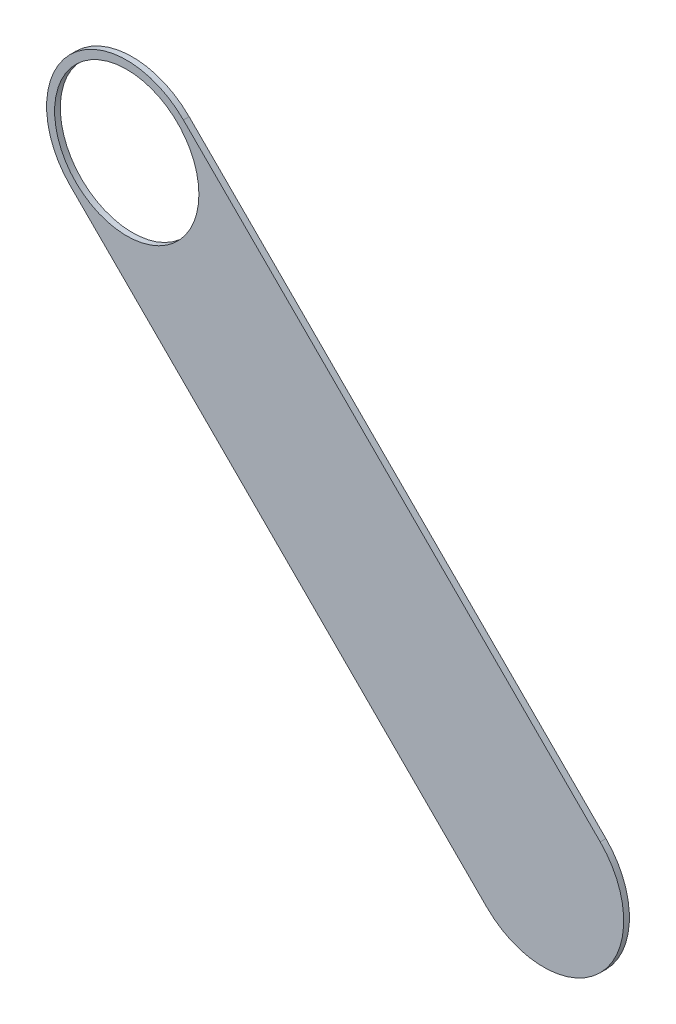
ISO-10303-21;
HEADER;
FILE_DESCRIPTION(('STEP AP214'),'2;1');
FILE_NAME('part.step','',(''),(''),'','','');
FILE_SCHEMA(('AUTOMOTIVE_DESIGN { 1 0 10303 214 1 1 1 1 }'));
ENDSEC;
DATA;
#1=APPLICATION_CONTEXT('core data for automotive mechanical design processes');
#2=APPLICATION_PROTOCOL_DEFINITION('international standard','automotive_design',2000,#1);
#3=PRODUCT_CONTEXT('',#1,'mechanical');
#4=PRODUCT('Part','Part','',(#3));
#5=PRODUCT_RELATED_PRODUCT_CATEGORY('part','',(#4));
#6=PRODUCT_DEFINITION_FORMATION('','',#4);
#7=PRODUCT_DEFINITION_CONTEXT('part definition',#1,'design');
#8=PRODUCT_DEFINITION('design','',#6,#7);
#9=PRODUCT_DEFINITION_SHAPE('','',#8);
#10=(LENGTH_UNIT() NAMED_UNIT(*) SI_UNIT(.MILLI.,.METRE.));
#11=(NAMED_UNIT(*) PLANE_ANGLE_UNIT() SI_UNIT($,.RADIAN.));
#12=(NAMED_UNIT(*) SI_UNIT($,.STERADIAN.) SOLID_ANGLE_UNIT());
#13=UNCERTAINTY_MEASURE_WITH_UNIT(LENGTH_MEASURE(1.E-05),#10,'distance_accuracy_value','');
#14=(GEOMETRIC_REPRESENTATION_CONTEXT(3) GLOBAL_UNCERTAINTY_ASSIGNED_CONTEXT((#13)) GLOBAL_UNIT_ASSIGNED_CONTEXT((#10,
#11,#12)) REPRESENTATION_CONTEXT('',''));
#15=CARTESIAN_POINT('',(0.,0.,0.));
#16=DIRECTION('',(0.,0.,1.));
#17=DIRECTION('',(1.,0.,0.));
#18=AXIS2_PLACEMENT_3D('',#15,#16,#17);
#19=CARTESIAN_POINT('',(116.94644124,74.1264583,0.));
#20=DIRECTION('',(0.707106781186548,0.707106781186548,0.));
#21=DIRECTION('',(0.707106781186548,-0.707106781186548,0.));
#22=AXIS2_PLACEMENT_3D('',#19,#20,#21);
#23=PLANE('',#22);
#24=DIRECTION('',(0.707106781186548,-0.707106781186548,0.));
#25=VECTOR('',#24,1.);
#26=CARTESIAN_POINT('',(116.94644124,74.1264583,0.03556));
#27=LINE('',#26,#25);
#28=CARTESIAN_POINT('',(116.94644124,74.1264583,0.03556));
#29=VERTEX_POINT('',#28);
#30=CARTESIAN_POINT('',(119.5464462,71.52645334,0.03556));
#31=VERTEX_POINT('',#30);
#32=EDGE_CURVE('E11',#29,#31,#27,.T.);
#33=ORIENTED_EDGE('',*,*,#32,.F.);
#34=DIRECTION('',(0.,0.,1.));
#35=VECTOR('',#34,1.);
#36=CARTESIAN_POINT('',(116.94644124,74.1264583,0.));
#37=LINE('',#36,#35);
#38=CARTESIAN_POINT('',(116.94644124,74.1264583,0.));
#39=VERTEX_POINT('',#38);
#40=EDGE_CURVE('E24',#39,#29,#37,.T.);
#41=ORIENTED_EDGE('',*,*,#40,.F.);
#42=DIRECTION('',(0.707106781186548,-0.707106781186548,0.));
#43=VECTOR('',#42,1.);
#44=CARTESIAN_POINT('',(116.94644124,74.1264583,0.));
#45=LINE('',#44,#43);
#46=CARTESIAN_POINT('',(119.5464462,71.52645334,0.));
#47=VERTEX_POINT('',#46);
#48=EDGE_CURVE('E96',#39,#47,#45,.T.);
#49=ORIENTED_EDGE('',*,*,#48,.T.);
#50=DIRECTION('',(0.,0.,1.));
#51=VECTOR('',#50,1.);
#52=CARTESIAN_POINT('',(119.5464462,71.52645334,0.));
#53=LINE('',#52,#51);
#54=EDGE_CURVE('E37',#47,#31,#53,.T.);
#55=ORIENTED_EDGE('',*,*,#54,.T.);
#56=EDGE_LOOP('',(#33,#41,#49,#55));
#57=FACE_BOUND('',#56,.T.);
#58=ADVANCED_FACE('F17',(#57),#23,.F.);
#59=CARTESIAN_POINT('',(117.299994,74.48001106,0.));
#60=DIRECTION('',(0.,0.,-1.));
#61=DIRECTION('',(0.707106781186533,0.707106781186562,0.));
#62=AXIS2_PLACEMENT_3D('',#59,#60,#61);
#63=CYLINDRICAL_SURFACE('',#62,0.499999108206436);
#64=CARTESIAN_POINT('',(117.299994,74.48001106,0.03556));
#65=DIRECTION('',(0.,0.,1.));
#66=DIRECTION('',(0.707106781186533,0.707106781186562,0.));
#67=AXIS2_PLACEMENT_3D('',#64,#65,#66);
#68=CIRCLE('',#67,0.499999108206436);
#69=CARTESIAN_POINT('',(117.65354676,74.83356382,0.03556));
#70=VERTEX_POINT('',#69);
#71=EDGE_CURVE('E92',#70,#29,#68,.T.);
#72=ORIENTED_EDGE('',*,*,#71,.F.);
#73=DIRECTION('',(0.,0.,1.));
#74=VECTOR('',#73,1.);
#75=CARTESIAN_POINT('',(117.65354676,74.83356382,0.));
#76=LINE('',#75,#74);
#77=CARTESIAN_POINT('',(117.65354676,74.83356382,0.));
#78=VERTEX_POINT('',#77);
#79=EDGE_CURVE('E90',#78,#70,#76,.T.);
#80=ORIENTED_EDGE('',*,*,#79,.F.);
#81=CARTESIAN_POINT('',(117.299994,74.48001106,0.));
#82=DIRECTION('',(0.,0.,1.));
#83=DIRECTION('',(0.707106781186533,0.707106781186562,0.));
#84=AXIS2_PLACEMENT_3D('',#81,#82,#83);
#85=CIRCLE('',#84,0.499999108206436);
#86=EDGE_CURVE('E88',#78,#39,#85,.T.);
#87=ORIENTED_EDGE('',*,*,#86,.T.);
#88=ORIENTED_EDGE('',*,*,#40,.T.);
#89=EDGE_LOOP('',(#72,#80,#87,#88));
#90=FACE_BOUND('',#89,.T.);
#91=ADVANCED_FACE('F111',(#90),#63,.T.);
#92=CARTESIAN_POINT('',(119.89999896,71.8800061,0.));
#93=DIRECTION('',(0.,0.,-1.));
#94=DIRECTION('',(-0.707106781186533,-0.707106781186562,0.));
#95=AXIS2_PLACEMENT_3D('',#92,#93,#94);
#96=CYLINDRICAL_SURFACE('',#95,0.499999108206439);
#97=CARTESIAN_POINT('',(119.89999896,71.8800061,0.03556));
#98=DIRECTION('',(0.,0.,1.));
#99=DIRECTION('',(-0.707106781186533,-0.707106781186562,0.));
#100=AXIS2_PLACEMENT_3D('',#97,#98,#99);
#101=CIRCLE('',#100,0.499999108206439);
#102=CARTESIAN_POINT('',(120.25355172,72.23355886,0.03556));
#103=VERTEX_POINT('',#102);
#104=EDGE_CURVE('E85',#31,#103,#101,.T.);
#105=ORIENTED_EDGE('',*,*,#104,.F.);
#106=ORIENTED_EDGE('',*,*,#54,.F.);
#107=CARTESIAN_POINT('',(119.89999896,71.8800061,0.));
#108=DIRECTION('',(0.,0.,1.));
#109=DIRECTION('',(-0.707106781186533,-0.707106781186562,0.));
#110=AXIS2_PLACEMENT_3D('',#107,#108,#109);
#111=CIRCLE('',#110,0.499999108206439);
#112=CARTESIAN_POINT('',(120.25355172,72.23355886,0.));
#113=VERTEX_POINT('',#112);
#114=EDGE_CURVE('E82',#47,#113,#111,.T.);
#115=ORIENTED_EDGE('',*,*,#114,.T.);
#116=DIRECTION('',(0.,0.,1.));
#117=VECTOR('',#116,1.);
#118=CARTESIAN_POINT('',(120.25355172,72.23355886,0.));
#119=LINE('',#118,#117);
#120=EDGE_CURVE('E80',#113,#103,#119,.T.);
#121=ORIENTED_EDGE('',*,*,#120,.T.);
#122=EDGE_LOOP('',(#105,#106,#115,#121));
#123=FACE_BOUND('',#122,.T.);
#124=ADVANCED_FACE('F104',(#123),#96,.T.);
#125=CARTESIAN_POINT('',(120.25355172,72.23355886,0.));
#126=DIRECTION('',(-0.707106781186546,-0.70710678118655,0.));
#127=DIRECTION('',(-0.70710678118655,0.707106781186546,0.));
#128=AXIS2_PLACEMENT_3D('',#125,#126,#127);
#129=PLANE('',#128);
#130=DIRECTION('',(-0.70710678118655,0.707106781186546,0.));
#131=VECTOR('',#130,1.);
#132=CARTESIAN_POINT('',(120.25355172,72.23355886,0.03556));
#133=LINE('',#132,#131);
#134=EDGE_CURVE('E77',#103,#70,#133,.T.);
#135=ORIENTED_EDGE('',*,*,#134,.F.);
#136=ORIENTED_EDGE('',*,*,#120,.F.);
#137=DIRECTION('',(-0.70710678118655,0.707106781186546,0.));
#138=VECTOR('',#137,1.);
#139=CARTESIAN_POINT('',(120.25355172,72.23355886,0.));
#140=LINE('',#139,#138);
#141=EDGE_CURVE('E68',#113,#78,#140,.T.);
#142=ORIENTED_EDGE('',*,*,#141,.T.);
#143=ORIENTED_EDGE('',*,*,#79,.T.);
#144=EDGE_LOOP('',(#135,#136,#142,#143));
#145=FACE_BOUND('',#144,.T.);
#146=ADVANCED_FACE('F110',(#145),#129,.F.);
#147=CARTESIAN_POINT('',(117.299994,74.4800136,0.));
#148=DIRECTION('',(0.,0.,-1.));
#149=DIRECTION('',(1.,0.,0.));
#150=AXIS2_PLACEMENT_3D('',#147,#148,#149);
#151=CYLINDRICAL_SURFACE('',#150,0.4499991);
#152=DIRECTION('',(0.,0.,1.));
#153=VECTOR('',#152,1.);
#154=CARTESIAN_POINT('',(117.7499931,74.4800136,0.));
#155=LINE('',#154,#153);
#156=CARTESIAN_POINT('',(117.7499931,74.4800136,0.));
#157=VERTEX_POINT('',#156);
#158=CARTESIAN_POINT('',(117.7499931,74.4800136,0.03556));
#159=VERTEX_POINT('',#158);
#160=EDGE_CURVE('E62',#157,#159,#155,.T.);
#161=ORIENTED_EDGE('',*,*,#160,.T.);
#162=CARTESIAN_POINT('',(117.299994,74.4800136,0.03556));
#163=DIRECTION('',(0.,0.,1.));
#164=DIRECTION('',(1.,0.,0.));
#165=AXIS2_PLACEMENT_3D('',#162,#163,#164);
#166=CIRCLE('',#165,0.4499991);
#167=EDGE_CURVE('E67',#159,#159,#166,.T.);
#168=ORIENTED_EDGE('',*,*,#167,.T.);
#169=ORIENTED_EDGE('',*,*,#160,.F.);
#170=CARTESIAN_POINT('',(117.299994,74.4800136,0.));
#171=DIRECTION('',(0.,0.,1.));
#172=DIRECTION('',(1.,0.,0.));
#173=AXIS2_PLACEMENT_3D('',#170,#171,#172);
#174=CIRCLE('',#173,0.4499991);
#175=EDGE_CURVE('E65',#157,#157,#174,.T.);
#176=ORIENTED_EDGE('',*,*,#175,.F.);
#177=EDGE_LOOP('',(#161,#168,#169,#176));
#178=FACE_BOUND('',#177,.T.);
#179=ADVANCED_FACE('F64',(#178),#151,.F.);
#180=CARTESIAN_POINT('',(116.94644124,74.1264583,0.));
#181=DIRECTION('',(0.,0.,-1.));
#182=DIRECTION('',(-1.,0.,0.));
#183=AXIS2_PLACEMENT_3D('',#180,#181,#182);
#184=PLANE('',#183);
#185=ORIENTED_EDGE('',*,*,#48,.F.);
#186=ORIENTED_EDGE('',*,*,#86,.F.);
#187=ORIENTED_EDGE('',*,*,#141,.F.);
#188=ORIENTED_EDGE('',*,*,#114,.F.);
#189=EDGE_LOOP('',(#185,#186,#187,#188));
#190=FACE_BOUND('',#189,.T.);
#191=ORIENTED_EDGE('',*,*,#175,.T.);
#192=EDGE_LOOP('',(#191));
#193=FACE_BOUND('',#192,.T.);
#194=ADVANCED_FACE('F71',(#190,#193),#184,.T.);
#195=CARTESIAN_POINT('',(116.94644124,74.1264583,0.03556));
#196=DIRECTION('',(0.,0.,-1.));
#197=DIRECTION('',(-1.,0.,0.));
#198=AXIS2_PLACEMENT_3D('',#195,#196,#197);
#199=PLANE('',#198);
#200=ORIENTED_EDGE('',*,*,#134,.T.);
#201=ORIENTED_EDGE('',*,*,#71,.T.);
#202=ORIENTED_EDGE('',*,*,#32,.T.);
#203=ORIENTED_EDGE('',*,*,#104,.T.);
#204=EDGE_LOOP('',(#200,#201,#202,#203));
#205=FACE_BOUND('',#204,.T.);
#206=ORIENTED_EDGE('',*,*,#167,.F.);
#207=EDGE_LOOP('',(#206));
#208=FACE_BOUND('',#207,.T.);
#209=ADVANCED_FACE('F107',(#205,#208),#199,.F.);
#210=CLOSED_SHELL('',(#58,#91,#124,#146,#179,#194,#209));
#211=MANIFOLD_SOLID_BREP('B1',#210);
#212=ADVANCED_BREP_SHAPE_REPRESENTATION('',(#18,#211),#14);
#213=SHAPE_DEFINITION_REPRESENTATION(#9,#212);
ENDSEC;
END-ISO-10303-21;
